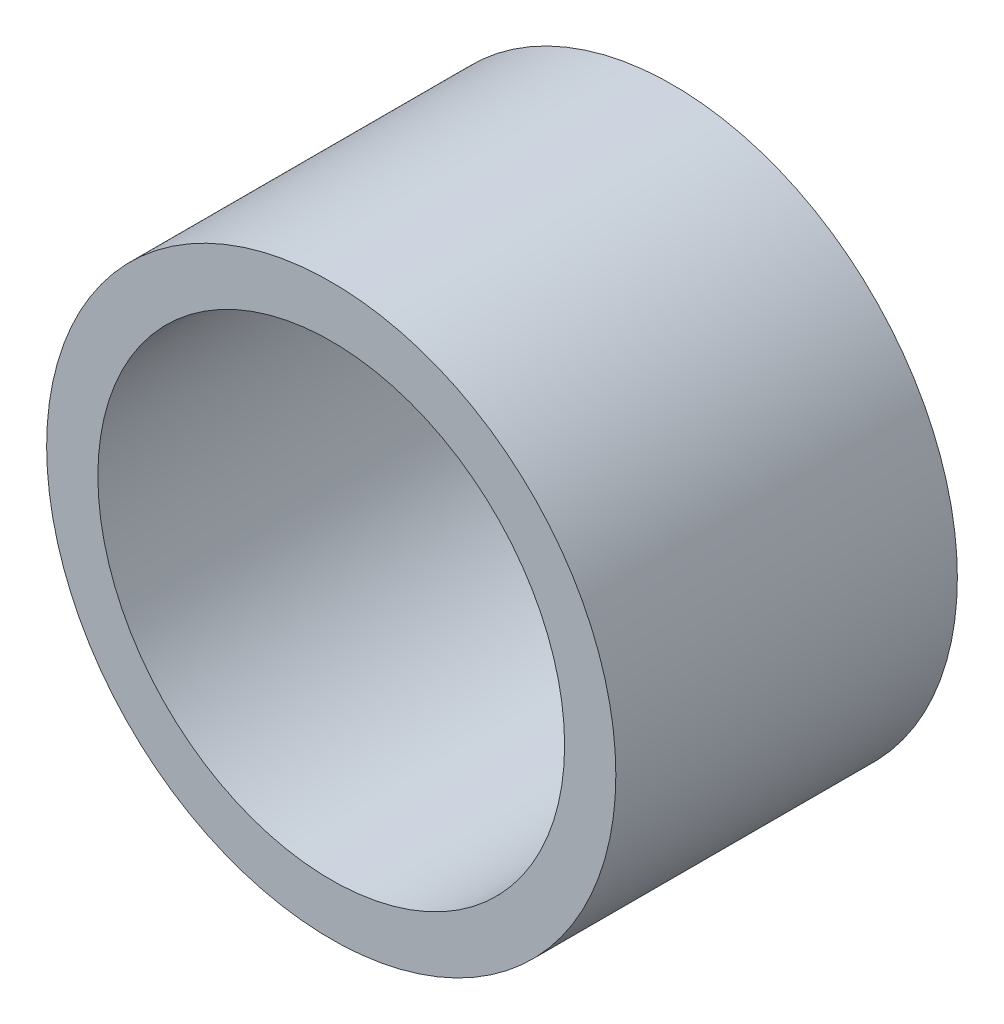
ISO-10303-21;
HEADER;
FILE_DESCRIPTION(('STEP AP214'),'2;1');
FILE_NAME('part.step','',(''),(''),'','','');
FILE_SCHEMA(('AUTOMOTIVE_DESIGN { 1 0 10303 214 1 1 1 1 }'));
ENDSEC;
DATA;
#1=APPLICATION_CONTEXT('core data for automotive mechanical design processes');
#2=APPLICATION_PROTOCOL_DEFINITION('international standard','automotive_design',2000,#1);
#3=PRODUCT_CONTEXT('',#1,'mechanical');
#4=PRODUCT('Part','Part','',(#3));
#5=PRODUCT_RELATED_PRODUCT_CATEGORY('part','',(#4));
#6=PRODUCT_DEFINITION_FORMATION('','',#4);
#7=PRODUCT_DEFINITION_CONTEXT('part definition',#1,'design');
#8=PRODUCT_DEFINITION('design','',#6,#7);
#9=PRODUCT_DEFINITION_SHAPE('','',#8);
#10=(LENGTH_UNIT() NAMED_UNIT(*) SI_UNIT(.MILLI.,.METRE.));
#11=(NAMED_UNIT(*) PLANE_ANGLE_UNIT() SI_UNIT($,.RADIAN.));
#12=(NAMED_UNIT(*) SI_UNIT($,.STERADIAN.) SOLID_ANGLE_UNIT());
#13=UNCERTAINTY_MEASURE_WITH_UNIT(LENGTH_MEASURE(1.E-05),#10,'distance_accuracy_value','');
#14=(GEOMETRIC_REPRESENTATION_CONTEXT(3) GLOBAL_UNCERTAINTY_ASSIGNED_CONTEXT((#13)) GLOBAL_UNIT_ASSIGNED_CONTEXT((#10,
#11,#12)) REPRESENTATION_CONTEXT('',''));
#15=CARTESIAN_POINT('',(0.,0.,0.));
#16=DIRECTION('',(0.,0.,1.));
#17=DIRECTION('',(1.,0.,0.));
#18=AXIS2_PLACEMENT_3D('',#15,#16,#17);
#19=CARTESIAN_POINT('',(0.,0.,6.));
#20=DIRECTION('',(0.,0.,1.));
#21=DIRECTION('',(1.,0.,0.));
#22=AXIS2_PLACEMENT_3D('',#19,#20,#21);
#23=PLANE('',#22);
#24=CARTESIAN_POINT('',(0.,0.,6.));
#25=DIRECTION('',(0.,0.,1.));
#26=DIRECTION('',(1.,0.,0.));
#27=AXIS2_PLACEMENT_3D('',#24,#25,#26);
#28=CIRCLE('',#27,5.);
#29=CARTESIAN_POINT('',(5.,0.,6.));
#30=VERTEX_POINT('',#29);
#31=EDGE_CURVE('E10',#30,#30,#28,.T.);
#32=ORIENTED_EDGE('',*,*,#31,.T.);
#33=EDGE_LOOP('',(#32));
#34=FACE_BOUND('',#33,.T.);
#35=CARTESIAN_POINT('',(0.,0.,6.));
#36=DIRECTION('',(0.,0.,1.));
#37=DIRECTION('',(1.,0.,0.));
#38=AXIS2_PLACEMENT_3D('',#35,#36,#37);
#39=CIRCLE('',#38,4.1);
#40=CARTESIAN_POINT('',(4.1,0.,6.));
#41=VERTEX_POINT('',#40);
#42=EDGE_CURVE('E48',#41,#41,#39,.T.);
#43=ORIENTED_EDGE('',*,*,#42,.F.);
#44=EDGE_LOOP('',(#43));
#45=FACE_BOUND('',#44,.T.);
#46=ADVANCED_FACE('F37',(#34,#45),#23,.T.);
#47=CARTESIAN_POINT('',(0.,0.,0.));
#48=DIRECTION('',(0.,0.,1.));
#49=DIRECTION('',(1.,0.,0.));
#50=AXIS2_PLACEMENT_3D('',#47,#48,#49);
#51=PLANE('',#50);
#52=CARTESIAN_POINT('',(0.,0.,0.));
#53=DIRECTION('',(0.,0.,1.));
#54=DIRECTION('',(1.,0.,0.));
#55=AXIS2_PLACEMENT_3D('',#52,#53,#54);
#56=CIRCLE('',#55,5.);
#57=CARTESIAN_POINT('',(5.,0.,0.));
#58=VERTEX_POINT('',#57);
#59=EDGE_CURVE('E41',#58,#58,#56,.T.);
#60=ORIENTED_EDGE('',*,*,#59,.F.);
#61=EDGE_LOOP('',(#60));
#62=FACE_BOUND('',#61,.T.);
#63=CARTESIAN_POINT('',(0.,0.,0.));
#64=DIRECTION('',(0.,0.,1.));
#65=DIRECTION('',(1.,0.,0.));
#66=AXIS2_PLACEMENT_3D('',#63,#64,#65);
#67=CIRCLE('',#66,4.1);
#68=CARTESIAN_POINT('',(4.1,0.,0.));
#69=VERTEX_POINT('',#68);
#70=EDGE_CURVE('E50',#69,#69,#67,.T.);
#71=ORIENTED_EDGE('',*,*,#70,.T.);
#72=EDGE_LOOP('',(#71));
#73=FACE_BOUND('',#72,.T.);
#74=ADVANCED_FACE('F60',(#62,#73),#51,.F.);
#75=CARTESIAN_POINT('',(0.,0.,6.));
#76=DIRECTION('',(0.,0.,-1.));
#77=DIRECTION('',(-1.,0.,0.));
#78=AXIS2_PLACEMENT_3D('',#75,#76,#77);
#79=CYLINDRICAL_SURFACE('',#78,5.);
#80=ORIENTED_EDGE('',*,*,#31,.F.);
#81=EDGE_LOOP('',(#80));
#82=FACE_BOUND('',#81,.T.);
#83=ORIENTED_EDGE('',*,*,#59,.T.);
#84=EDGE_LOOP('',(#83));
#85=FACE_BOUND('',#84,.T.);
#86=ADVANCED_FACE('F39',(#82,#85),#79,.T.);
#87=CARTESIAN_POINT('',(0.,0.,6.));
#88=DIRECTION('',(0.,0.,-1.));
#89=DIRECTION('',(-1.,0.,0.));
#90=AXIS2_PLACEMENT_3D('',#87,#88,#89);
#91=CYLINDRICAL_SURFACE('',#90,4.1);
#92=ORIENTED_EDGE('',*,*,#42,.T.);
#93=EDGE_LOOP('',(#92));
#94=FACE_BOUND('',#93,.T.);
#95=ORIENTED_EDGE('',*,*,#70,.F.);
#96=EDGE_LOOP('',(#95));
#97=FACE_BOUND('',#96,.T.);
#98=ADVANCED_FACE('F56',(#94,#97),#91,.F.);
#99=CLOSED_SHELL('',(#46,#74,#86,#98));
#100=MANIFOLD_SOLID_BREP('B2',#99);
#101=ADVANCED_BREP_SHAPE_REPRESENTATION('',(#18,#100),#14);
#102=SHAPE_DEFINITION_REPRESENTATION(#9,#101);
ENDSEC;
END-ISO-10303-21;
